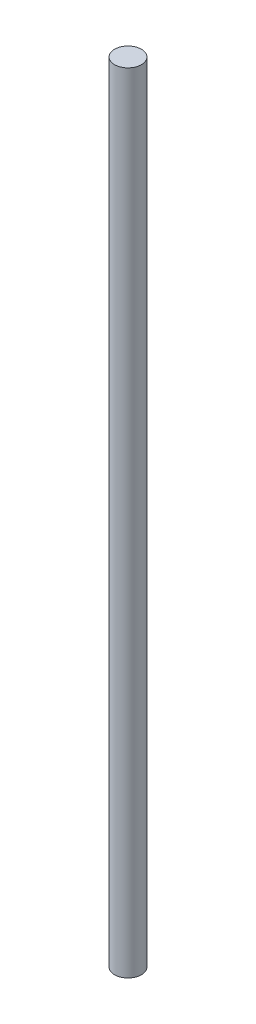
ISO-10303-21;
HEADER;
FILE_DESCRIPTION(('STEP AP214'),'2;1');
FILE_NAME('part.step','',(''),(''),'','','');
FILE_SCHEMA(('AUTOMOTIVE_DESIGN { 1 0 10303 214 1 1 1 1 }'));
ENDSEC;
DATA;
#1=APPLICATION_CONTEXT('core data for automotive mechanical design processes');
#2=APPLICATION_PROTOCOL_DEFINITION('international standard','automotive_design',2000,#1);
#3=PRODUCT_CONTEXT('',#1,'mechanical');
#4=PRODUCT('Part','Part','',(#3));
#5=PRODUCT_RELATED_PRODUCT_CATEGORY('part','',(#4));
#6=PRODUCT_DEFINITION_FORMATION('','',#4);
#7=PRODUCT_DEFINITION_CONTEXT('part definition',#1,'design');
#8=PRODUCT_DEFINITION('design','',#6,#7);
#9=PRODUCT_DEFINITION_SHAPE('','',#8);
#10=(LENGTH_UNIT() NAMED_UNIT(*) SI_UNIT(.MILLI.,.METRE.));
#11=(NAMED_UNIT(*) PLANE_ANGLE_UNIT() SI_UNIT($,.RADIAN.));
#12=(NAMED_UNIT(*) SI_UNIT($,.STERADIAN.) SOLID_ANGLE_UNIT());
#13=UNCERTAINTY_MEASURE_WITH_UNIT(LENGTH_MEASURE(1.E-05),#10,'distance_accuracy_value','');
#14=(GEOMETRIC_REPRESENTATION_CONTEXT(3) GLOBAL_UNCERTAINTY_ASSIGNED_CONTEXT((#13)) GLOBAL_UNIT_ASSIGNED_CONTEXT((#10,
#11,#12)) REPRESENTATION_CONTEXT('',''));
#15=CARTESIAN_POINT('',(0.,0.,0.));
#16=DIRECTION('',(0.,0.,1.));
#17=DIRECTION('',(1.,0.,0.));
#18=AXIS2_PLACEMENT_3D('',#15,#16,#17);
#19=CARTESIAN_POINT('',(0.,500.,0.));
#20=DIRECTION('',(0.,-1.,0.));
#21=DIRECTION('',(0.,0.,-1.));
#22=AXIS2_PLACEMENT_3D('',#19,#20,#21);
#23=CYLINDRICAL_SURFACE('',#22,8.5);
#24=CARTESIAN_POINT('',(0.,500.,0.));
#25=DIRECTION('',(0.,1.,0.));
#26=DIRECTION('',(0.,0.,1.));
#27=AXIS2_PLACEMENT_3D('',#24,#25,#26);
#28=CIRCLE('',#27,8.5);
#29=CARTESIAN_POINT('',(0.,500.,8.5));
#30=VERTEX_POINT('',#29);
#31=EDGE_CURVE('E10',#30,#30,#28,.T.);
#32=ORIENTED_EDGE('',*,*,#31,.F.);
#33=EDGE_LOOP('',(#32));
#34=FACE_BOUND('',#33,.T.);
#35=CARTESIAN_POINT('',(0.,0.,0.));
#36=DIRECTION('',(0.,1.,0.));
#37=DIRECTION('',(0.,0.,1.));
#38=AXIS2_PLACEMENT_3D('',#35,#36,#37);
#39=CIRCLE('',#38,8.5);
#40=CARTESIAN_POINT('',(0.,0.,8.5));
#41=VERTEX_POINT('',#40);
#42=EDGE_CURVE('E36',#41,#41,#39,.T.);
#43=ORIENTED_EDGE('',*,*,#42,.T.);
#44=EDGE_LOOP('',(#43));
#45=FACE_BOUND('',#44,.T.);
#46=ADVANCED_FACE('F33',(#34,#45),#23,.T.);
#47=CARTESIAN_POINT('',(0.,500.,0.));
#48=DIRECTION('',(0.,1.,0.));
#49=DIRECTION('',(0.,0.,1.));
#50=AXIS2_PLACEMENT_3D('',#47,#48,#49);
#51=PLANE('',#50);
#52=ORIENTED_EDGE('',*,*,#31,.T.);
#53=EDGE_LOOP('',(#52));
#54=FACE_BOUND('',#53,.T.);
#55=ADVANCED_FACE('F48',(#54),#51,.T.);
#56=CARTESIAN_POINT('',(0.,0.,0.));
#57=DIRECTION('',(0.,1.,0.));
#58=DIRECTION('',(0.,0.,1.));
#59=AXIS2_PLACEMENT_3D('',#56,#57,#58);
#60=PLANE('',#59);
#61=ORIENTED_EDGE('',*,*,#42,.F.);
#62=EDGE_LOOP('',(#61));
#63=FACE_BOUND('',#62,.T.);
#64=ADVANCED_FACE('F46',(#63),#60,.F.);
#65=CLOSED_SHELL('',(#46,#55,#64));
#66=MANIFOLD_SOLID_BREP('B2',#65);
#67=ADVANCED_BREP_SHAPE_REPRESENTATION('',(#18,#66),#14);
#68=SHAPE_DEFINITION_REPRESENTATION(#9,#67);
ENDSEC;
END-ISO-10303-21;
